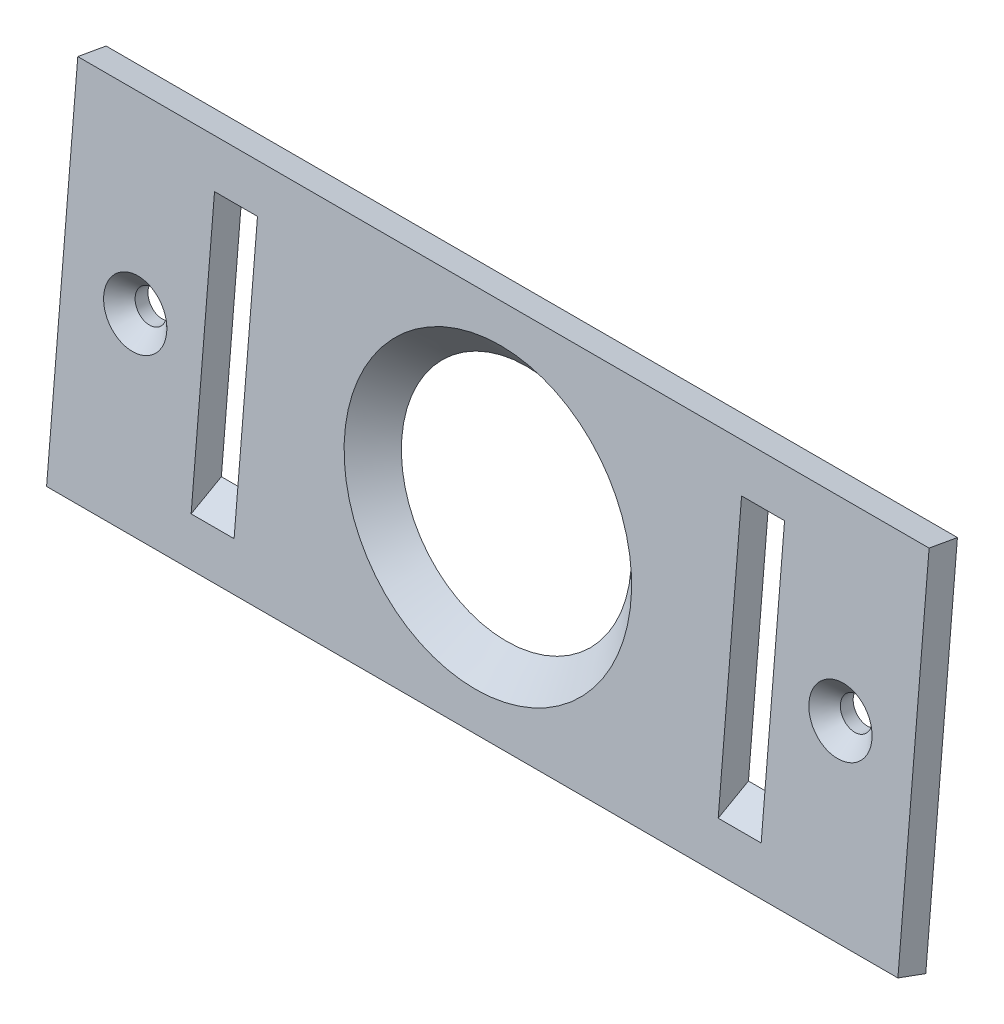
ISO-10303-21;
HEADER;
FILE_DESCRIPTION(('STEP AP214'),'2;1');
FILE_NAME('part.step','',(''),(''),'','','');
FILE_SCHEMA(('AUTOMOTIVE_DESIGN { 1 0 10303 214 1 1 1 1 }'));
ENDSEC;
DATA;
#1=APPLICATION_CONTEXT('core data for automotive mechanical design processes');
#2=APPLICATION_PROTOCOL_DEFINITION('international standard','automotive_design',2000,#1);
#3=PRODUCT_CONTEXT('',#1,'mechanical');
#4=PRODUCT('Part','Part','',(#3));
#5=PRODUCT_RELATED_PRODUCT_CATEGORY('part','',(#4));
#6=PRODUCT_DEFINITION_FORMATION('','',#4);
#7=PRODUCT_DEFINITION_CONTEXT('part definition',#1,'design');
#8=PRODUCT_DEFINITION('design','',#6,#7);
#9=PRODUCT_DEFINITION_SHAPE('','',#8);
#10=(LENGTH_UNIT() NAMED_UNIT(*) SI_UNIT(.MILLI.,.METRE.));
#11=(NAMED_UNIT(*) PLANE_ANGLE_UNIT() SI_UNIT($,.RADIAN.));
#12=(NAMED_UNIT(*) SI_UNIT($,.STERADIAN.) SOLID_ANGLE_UNIT());
#13=UNCERTAINTY_MEASURE_WITH_UNIT(LENGTH_MEASURE(1.E-05),#10,'distance_accuracy_value','');
#14=(GEOMETRIC_REPRESENTATION_CONTEXT(3) GLOBAL_UNCERTAINTY_ASSIGNED_CONTEXT((#13)) GLOBAL_UNIT_ASSIGNED_CONTEXT((#10,
#11,#12)) REPRESENTATION_CONTEXT('',''));
#15=CARTESIAN_POINT('',(0.,0.,0.));
#16=DIRECTION('',(0.,0.,1.));
#17=DIRECTION('',(1.,0.,0.));
#18=AXIS2_PLACEMENT_3D('',#15,#16,#17);
#19=CARTESIAN_POINT('',(-0.0402016209033781,-70.383700116003,12.2294735347792));
#20=DIRECTION('',(0.,-0.939692620785918,0.342020143325643));
#21=DIRECTION('',(0.,-0.342020143325643,-0.939692620785918));
#22=AXIS2_PLACEMENT_3D('',#19,#20,#21);
#23=PLANE('',#22);
#24=DIRECTION('',(1.,0.,0.));
#25=VECTOR('',#24,1.);
#26=CARTESIAN_POINT('',(-1.80258672360719,-70.383700116003,12.2294735347792));
#27=LINE('',#26,#25);
#28=CARTESIAN_POINT('',(-29.72,-70.383700116003,12.2294735347792));
#29=VERTEX_POINT('',#28);
#30=CARTESIAN_POINT('',(29.72,-70.383700116003,12.2294735347792));
#31=VERTEX_POINT('',#30);
#32=EDGE_CURVE('E235',#29,#31,#27,.T.);
#33=ORIENTED_EDGE('',*,*,#32,.T.);
#34=DIRECTION('',(0.,0.342020143325643,0.939692620785918));
#35=VECTOR('',#34,1.);
#36=CARTESIAN_POINT('',(29.72,-66.0808482685836,24.0514618248237));
#37=LINE('',#36,#35);
#38=CARTESIAN_POINT('',(29.72,-69.675529500792,14.1751563091928));
#39=VERTEX_POINT('',#38);
#40=EDGE_CURVE('E231',#31,#39,#37,.T.);
#41=ORIENTED_EDGE('',*,*,#40,.T.);
#42=DIRECTION('',(-1.,0.,0.));
#43=VECTOR('',#42,1.);
#44=CARTESIAN_POINT('',(29.72,-69.675529500792,14.1751563091928));
#45=LINE('',#44,#43);
#46=CARTESIAN_POINT('',(-29.72,-69.675529500792,14.1751563091928));
#47=VERTEX_POINT('',#46);
#48=EDGE_CURVE('E236',#39,#47,#45,.T.);
#49=ORIENTED_EDGE('',*,*,#48,.T.);
#50=DIRECTION('',(0.,0.342020143325643,0.939692620785918));
#51=VECTOR('',#50,1.);
#52=CARTESIAN_POINT('',(-29.72,-66.0808482685836,24.0514618248237));
#53=LINE('',#52,#51);
#54=EDGE_CURVE('E178',#29,#47,#53,.T.);
#55=ORIENTED_EDGE('',*,*,#54,.F.);
#56=EDGE_LOOP('',(#33,#41,#49,#55));
#57=FACE_BOUND('',#56,.T.);
#58=ADVANCED_FACE('F45',(#57),#23,.T.);
#59=CARTESIAN_POINT('',(-0.0402016209033781,-44.7706620484984,11.9962627405015));
#60=DIRECTION('',(0.,0.984807753012095,-0.173648177667572));
#61=DIRECTION('',(0.,0.173648177667572,0.984807753012095));
#62=AXIS2_PLACEMENT_3D('',#59,#60,#61);
#63=PLANE('',#62);
#64=DIRECTION('',(-1.,0.,0.));
#65=VECTOR('',#64,1.);
#66=CARTESIAN_POINT('',(29.72,-44.7706620484984,11.9962627405015));
#67=LINE('',#66,#65);
#68=CARTESIAN_POINT('',(29.72,-44.7706620484984,11.9962627405015));
#69=VERTEX_POINT('',#68);
#70=CARTESIAN_POINT('',(-29.72,-44.7706620484984,11.9962627405015));
#71=VERTEX_POINT('',#70);
#72=EDGE_CURVE('E225',#69,#71,#67,.T.);
#73=ORIENTED_EDGE('',*,*,#72,.F.);
#74=DIRECTION('',(0.,-0.173648177667572,-0.984807753012095));
#75=VECTOR('',#74,1.);
#76=CARTESIAN_POINT('',(29.72,-45.4721431525227,8.01796570845798));
#77=LINE('',#76,#75);
#78=CARTESIAN_POINT('',(29.72,-45.1192850194902,10.0191236232216));
#79=VERTEX_POINT('',#78);
#80=EDGE_CURVE('E232',#69,#79,#77,.T.);
#81=ORIENTED_EDGE('',*,*,#80,.T.);
#82=DIRECTION('',(1.,0.,0.));
#83=VECTOR('',#82,1.);
#84=CARTESIAN_POINT('',(-1.80258672360719,-45.1192850194902,10.0191236232216));
#85=LINE('',#84,#83);
#86=CARTESIAN_POINT('',(-29.72,-45.1192850194902,10.0191236232216));
#87=VERTEX_POINT('',#86);
#88=EDGE_CURVE('E228',#87,#79,#85,.T.);
#89=ORIENTED_EDGE('',*,*,#88,.F.);
#90=DIRECTION('',(0.,-0.173648177667572,-0.984807753012095));
#91=VECTOR('',#90,1.);
#92=CARTESIAN_POINT('',(-29.72,-45.4721431525227,8.01796570845798));
#93=LINE('',#92,#91);
#94=EDGE_CURVE('E179',#71,#87,#93,.T.);
#95=ORIENTED_EDGE('',*,*,#94,.F.);
#96=EDGE_LOOP('',(#73,#81,#89,#95));
#97=FACE_BOUND('',#96,.T.);
#98=ADVANCED_FACE('F282',(#97),#63,.T.);
#99=CARTESIAN_POINT('',(29.72,-44.7706620484984,11.9962627405015));
#100=DIRECTION('',(0.,-0.0871557427476506,-0.996194698091746));
#101=DIRECTION('',(0.,0.996194698091746,-0.0871557427476506));
#102=AXIS2_PLACEMENT_3D('',#99,#100,#101);
#103=PLANE('',#102);
#104=CARTESIAN_POINT('',(0.,-57.2230957746453,13.0857095248472));
#105=DIRECTION('',(0.,-0.0871557427476506,-0.996194698091746));
#106=DIRECTION('',(0.,0.996194698091746,-0.0871557427476506));
#107=AXIS2_PLACEMENT_3D('',#104,#105,#106);
#108=CIRCLE('',#107,10.);
#109=CARTESIAN_POINT('',(0.,-47.2611487937278,12.2141520973707));
#110=VERTEX_POINT('',#109);
#111=EDGE_CURVE('E224',#110,#110,#108,.T.);
#112=ORIENTED_EDGE('',*,*,#111,.T.);
#113=EDGE_LOOP('',(#112));
#114=FACE_BOUND('',#113,.T.);
#115=DIRECTION('',(1.,0.,0.));
#116=VECTOR('',#115,1.);
#117=CARTESIAN_POINT('',(16.9,-66.5582832289655,13.9024325989896));
#118=LINE('',#117,#116);
#119=CARTESIAN_POINT('',(16.9,-66.5582832289655,13.9024325989896));
#120=VERTEX_POINT('',#119);
#121=CARTESIAN_POINT('',(19.9,-66.5582832289655,13.9024325989896));
#122=VERTEX_POINT('',#121);
#123=EDGE_CURVE('E203',#120,#122,#118,.T.);
#124=ORIENTED_EDGE('',*,*,#123,.F.);
#125=DIRECTION('',(0.,-0.996194698091746,0.0871557427476506));
#126=VECTOR('',#125,1.);
#127=CARTESIAN_POINT('',(16.9,-66.5582832289655,13.9024325989896));
#128=LINE('',#127,#126);
#129=CARTESIAN_POINT('',(16.9,-47.8879083203249,12.2689864507048));
#130=VERTEX_POINT('',#129);
#131=EDGE_CURVE('E195',#130,#120,#128,.T.);
#132=ORIENTED_EDGE('',*,*,#131,.F.);
#133=DIRECTION('',(1.,0.,0.));
#134=VECTOR('',#133,1.);
#135=CARTESIAN_POINT('',(16.9,-47.8879083203249,12.2689864507048));
#136=LINE('',#135,#134);
#137=CARTESIAN_POINT('',(19.9,-47.8879083203249,12.2689864507048));
#138=VERTEX_POINT('',#137);
#139=EDGE_CURVE('E208',#130,#138,#136,.T.);
#140=ORIENTED_EDGE('',*,*,#139,.T.);
#141=DIRECTION('',(0.,-0.996194698091746,0.0871557427476506));
#142=VECTOR('',#141,1.);
#143=CARTESIAN_POINT('',(19.9,-66.5582832289655,13.9024325989896));
#144=LINE('',#143,#142);
#145=EDGE_CURVE('E194',#138,#122,#144,.T.);
#146=ORIENTED_EDGE('',*,*,#145,.T.);
#147=EDGE_LOOP('',(#124,#132,#140,#146));
#148=FACE_BOUND('',#147,.T.);
#149=ORIENTED_EDGE('',*,*,#72,.T.);
#150=DIRECTION('',(0.,-0.996194698091746,0.0871557427476506));
#151=VECTOR('',#150,1.);
#152=CARTESIAN_POINT('',(-29.72,-44.7706620484984,11.9962627405015));
#153=LINE('',#152,#151);
#154=EDGE_CURVE('E175',#71,#47,#153,.T.);
#155=ORIENTED_EDGE('',*,*,#154,.T.);
#156=ORIENTED_EDGE('',*,*,#48,.F.);
#157=DIRECTION('',(0.,-0.996194698091746,0.0871557427476506));
#158=VECTOR('',#157,1.);
#159=CARTESIAN_POINT('',(29.72,-44.7706620484984,11.9962627405015));
#160=LINE('',#159,#158);
#161=EDGE_CURVE('E226',#69,#39,#160,.T.);
#162=ORIENTED_EDGE('',*,*,#161,.F.);
#163=EDGE_LOOP('',(#149,#155,#156,#162));
#164=FACE_BOUND('',#163,.T.);
#165=CARTESIAN_POINT('',(24.62,-57.2230957746452,13.0857095248472));
#166=DIRECTION('',(0.,0.0871557427476507,0.996194698091746));
#167=DIRECTION('',(0.,-0.996194698091746,0.0871557427476507));
#168=AXIS2_PLACEMENT_3D('',#165,#166,#167);
#169=CIRCLE('',#168,2.2);
#170=CARTESIAN_POINT('',(24.62,-59.414724110447,13.277452158892));
#171=VERTEX_POINT('',#170);
#172=EDGE_CURVE('E215',#171,#171,#169,.T.);
#173=ORIENTED_EDGE('',*,*,#172,.F.);
#174=EDGE_LOOP('',(#173));
#175=FACE_BOUND('',#174,.T.);
#176=DIRECTION('',(-1.,0.,0.));
#177=VECTOR('',#176,1.);
#178=CARTESIAN_POINT('',(-16.9,-66.5582832289655,13.9024325989896));
#179=LINE('',#178,#177);
#180=CARTESIAN_POINT('',(-16.9,-66.5582832289655,13.9024325989896));
#181=VERTEX_POINT('',#180);
#182=CARTESIAN_POINT('',(-19.9,-66.5582832289655,13.9024325989896));
#183=VERTEX_POINT('',#182);
#184=EDGE_CURVE('E151',#181,#183,#179,.T.);
#185=ORIENTED_EDGE('',*,*,#184,.T.);
#186=DIRECTION('',(0.,-0.996194698091746,0.0871557427476506));
#187=VECTOR('',#186,1.);
#188=CARTESIAN_POINT('',(-19.9,-66.5582832289655,13.9024325989896));
#189=LINE('',#188,#187);
#190=CARTESIAN_POINT('',(-19.9,-47.8879083203249,12.2689864507048));
#191=VERTEX_POINT('',#190);
#192=EDGE_CURVE('E503',#191,#183,#189,.T.);
#193=ORIENTED_EDGE('',*,*,#192,.F.);
#194=DIRECTION('',(-1.,0.,0.));
#195=VECTOR('',#194,1.);
#196=CARTESIAN_POINT('',(-16.9,-47.8879083203249,12.2689864507048));
#197=LINE('',#196,#195);
#198=CARTESIAN_POINT('',(-16.9,-47.8879083203249,12.2689864507048));
#199=VERTEX_POINT('',#198);
#200=EDGE_CURVE('E153',#199,#191,#197,.T.);
#201=ORIENTED_EDGE('',*,*,#200,.F.);
#202=DIRECTION('',(0.,-0.996194698091746,0.0871557427476506));
#203=VECTOR('',#202,1.);
#204=CARTESIAN_POINT('',(-16.9,-66.5582832289655,13.9024325989896));
#205=LINE('',#204,#203);
#206=EDGE_CURVE('E136',#199,#181,#205,.T.);
#207=ORIENTED_EDGE('',*,*,#206,.T.);
#208=EDGE_LOOP('',(#185,#193,#201,#207));
#209=FACE_BOUND('',#208,.T.);
#210=CARTESIAN_POINT('',(-24.62,-57.2230957746452,13.0857095248472));
#211=DIRECTION('',(0.,-0.0871557427476507,-0.996194698091746));
#212=DIRECTION('',(0.,-0.996194698091746,0.0871557427476507));
#213=AXIS2_PLACEMENT_3D('',#210,#211,#212);
#214=CIRCLE('',#213,2.2);
#215=CARTESIAN_POINT('',(-24.62,-59.414724110447,13.277452158892));
#216=VERTEX_POINT('',#215);
#217=EDGE_CURVE('E160',#216,#216,#214,.T.);
#218=ORIENTED_EDGE('',*,*,#217,.T.);
#219=EDGE_LOOP('',(#218));
#220=FACE_BOUND('',#219,.T.);
#221=ADVANCED_FACE('F148',(#114,#148,#164,#175,#209,#220),#103,.F.);
#222=CARTESIAN_POINT('',(29.72,0.,0.));
#223=DIRECTION('',(-1.,0.,0.));
#224=DIRECTION('',(0.,0.,1.));
#225=AXIS2_PLACEMENT_3D('',#222,#223,#224);
#226=PLANE('',#225);
#227=ORIENTED_EDGE('',*,*,#40,.F.);
#228=DIRECTION('',(0.,-0.996194698091747,0.0871557427476391));
#229=VECTOR('',#228,1.);
#230=CARTESIAN_POINT('',(29.72,0.527169618531685,6.02557631224523));
#231=LINE('',#230,#229);
#232=EDGE_CURVE('E222',#79,#31,#231,.T.);
#233=ORIENTED_EDGE('',*,*,#232,.F.);
#234=ORIENTED_EDGE('',*,*,#80,.F.);
#235=ORIENTED_EDGE('',*,*,#161,.T.);
#236=EDGE_LOOP('',(#227,#233,#234,#235));
#237=FACE_BOUND('',#236,.T.);
#238=ADVANCED_FACE('F281',(#237),#226,.F.);
#239=CARTESIAN_POINT('',(-1.80258672360719,-70.383700116003,12.2294735347792));
#240=DIRECTION('',(0.,-0.0871557427476391,-0.996194698091747));
#241=DIRECTION('',(0.,0.996194698091747,-0.0871557427476391));
#242=AXIS2_PLACEMENT_3D('',#239,#240,#241);
#243=PLANE('',#242);
#244=CARTESIAN_POINT('',(0.,-57.3974072601405,11.0933201286645));
#245=DIRECTION('',(0.,0.0871557427476508,0.996194698091746));
#246=DIRECTION('',(0.,-0.996194698091746,0.0871557427476508));
#247=AXIS2_PLACEMENT_3D('',#244,#245,#246);
#248=CIRCLE('',#247,8.);
#249=CARTESIAN_POINT('',(0.,-65.3669648448745,11.7905660706457));
#250=VERTEX_POINT('',#249);
#251=EDGE_CURVE('E211',#250,#250,#248,.T.);
#252=ORIENTED_EDGE('',*,*,#251,.T.);
#253=EDGE_LOOP('',(#252));
#254=FACE_BOUND('',#253,.T.);
#255=DIRECTION('',(0.,0.996194698091747,-0.0871557427476391));
#256=VECTOR('',#255,1.);
#257=CARTESIAN_POINT('',(16.9,-70.383700116003,12.2294735347792));
#258=LINE('',#257,#256);
#259=CARTESIAN_POINT('',(16.9,-65.366964844874,11.7905660706448));
#260=VERTEX_POINT('',#259);
#261=CARTESIAN_POINT('',(16.9,-49.427849675407,10.3960741866827));
#262=VERTEX_POINT('',#261);
#263=EDGE_CURVE('E11',#260,#262,#258,.T.);
#264=ORIENTED_EDGE('',*,*,#263,.F.);
#265=DIRECTION('',(-1.,0.,0.));
#266=VECTOR('',#265,1.);
#267=CARTESIAN_POINT('',(-1.80258672360719,-65.366964844874,11.7905660706448));
#268=LINE('',#267,#266);
#269=CARTESIAN_POINT('',(19.9,-65.366964844874,11.7905660706448));
#270=VERTEX_POINT('',#269);
#271=EDGE_CURVE('E249',#270,#260,#268,.T.);
#272=ORIENTED_EDGE('',*,*,#271,.F.);
#273=DIRECTION('',(0.,0.996194698091747,-0.0871557427476391));
#274=VECTOR('',#273,1.);
#275=CARTESIAN_POINT('',(19.9,-70.383700116003,12.2294735347792));
#276=LINE('',#275,#274);
#277=CARTESIAN_POINT('',(19.9,-49.427849675407,10.3960741866827));
#278=VERTEX_POINT('',#277);
#279=EDGE_CURVE('E246',#270,#278,#276,.T.);
#280=ORIENTED_EDGE('',*,*,#279,.T.);
#281=DIRECTION('',(1.,0.,0.));
#282=VECTOR('',#281,1.);
#283=CARTESIAN_POINT('',(-1.80258672360719,-49.427849675407,10.3960741866827));
#284=LINE('',#283,#282);
#285=EDGE_CURVE('E54',#262,#278,#284,.T.);
#286=ORIENTED_EDGE('',*,*,#285,.F.);
#287=EDGE_LOOP('',(#264,#272,#280,#286));
#288=FACE_BOUND('',#287,.T.);
#289=CARTESIAN_POINT('',(24.62,-57.3974072601405,11.0933201286638));
#290=DIRECTION('',(0.,-0.0871557427476391,-0.996194698091747));
#291=DIRECTION('',(0.,0.996194698091747,-0.0871557427476391));
#292=AXIS2_PLACEMENT_3D('',#289,#290,#291);
#293=CIRCLE('',#292,1.09999999999999);
#294=CARTESIAN_POINT('',(24.62,-56.3015930922396,10.9974488116414));
#295=VERTEX_POINT('',#294);
#296=EDGE_CURVE('E221',#295,#295,#293,.T.);
#297=ORIENTED_EDGE('',*,*,#296,.F.);
#298=EDGE_LOOP('',(#297));
#299=FACE_BOUND('',#298,.T.);
#300=ORIENTED_EDGE('',*,*,#32,.F.);
#301=DIRECTION('',(0.,-0.996194698091747,0.0871557427476391));
#302=VECTOR('',#301,1.);
#303=CARTESIAN_POINT('',(-29.72,0.527169618531685,6.02557631224523));
#304=LINE('',#303,#302);
#305=EDGE_CURVE('E171',#87,#29,#304,.T.);
#306=ORIENTED_EDGE('',*,*,#305,.F.);
#307=ORIENTED_EDGE('',*,*,#88,.T.);
#308=ORIENTED_EDGE('',*,*,#232,.T.);
#309=EDGE_LOOP('',(#300,#306,#307,#308));
#310=FACE_BOUND('',#309,.T.);
#311=DIRECTION('',(0.,0.996194698091747,-0.0871557427476391));
#312=VECTOR('',#311,1.);
#313=CARTESIAN_POINT('',(-16.9,-70.383700116003,12.2294735347792));
#314=LINE('',#313,#312);
#315=CARTESIAN_POINT('',(-16.9,-65.366964844874,11.7905660706448));
#316=VERTEX_POINT('',#315);
#317=CARTESIAN_POINT('',(-16.9,-49.427849675407,10.3960741866827));
#318=VERTEX_POINT('',#317);
#319=EDGE_CURVE('E139',#316,#318,#314,.T.);
#320=ORIENTED_EDGE('',*,*,#319,.T.);
#321=DIRECTION('',(-1.,0.,0.));
#322=VECTOR('',#321,1.);
#323=CARTESIAN_POINT('',(1.80258672360719,-49.427849675407,10.3960741866827));
#324=LINE('',#323,#322);
#325=CARTESIAN_POINT('',(-19.9,-49.427849675407,10.3960741866827));
#326=VERTEX_POINT('',#325);
#327=EDGE_CURVE('E190',#318,#326,#324,.T.);
#328=ORIENTED_EDGE('',*,*,#327,.T.);
#329=DIRECTION('',(0.,0.996194698091747,-0.0871557427476391));
#330=VECTOR('',#329,1.);
#331=CARTESIAN_POINT('',(-19.9,-70.383700116003,12.2294735347792));
#332=LINE('',#331,#330);
#333=CARTESIAN_POINT('',(-19.9,-65.366964844874,11.7905660706448));
#334=VERTEX_POINT('',#333);
#335=EDGE_CURVE('E174',#334,#326,#332,.T.);
#336=ORIENTED_EDGE('',*,*,#335,.F.);
#337=DIRECTION('',(1.,0.,0.));
#338=VECTOR('',#337,1.);
#339=CARTESIAN_POINT('',(1.80258672360719,-65.366964844874,11.7905660706448));
#340=LINE('',#339,#338);
#341=EDGE_CURVE('E188',#334,#316,#340,.T.);
#342=ORIENTED_EDGE('',*,*,#341,.T.);
#343=EDGE_LOOP('',(#320,#328,#336,#342));
#344=FACE_BOUND('',#343,.T.);
#345=CARTESIAN_POINT('',(-24.62,-57.3974072601405,11.0933201286638));
#346=DIRECTION('',(0.,0.0871557427476391,0.996194698091747));
#347=DIRECTION('',(0.,0.996194698091747,-0.0871557427476391));
#348=AXIS2_PLACEMENT_3D('',#345,#346,#347);
#349=CIRCLE('',#348,1.09999999999999);
#350=CARTESIAN_POINT('',(-24.62,-56.3015930922396,10.9974488116414));
#351=VERTEX_POINT('',#350);
#352=EDGE_CURVE('E170',#351,#351,#349,.T.);
#353=ORIENTED_EDGE('',*,*,#352,.T.);
#354=EDGE_LOOP('',(#353));
#355=FACE_BOUND('',#354,.T.);
#356=ADVANCED_FACE('F258',(#254,#288,#299,#310,#344,#355),#243,.T.);
#357=CARTESIAN_POINT('',(24.62,-57.2230957746452,13.0857095248472));
#358=DIRECTION('',(0.,0.0871557427476507,0.996194698091746));
#359=DIRECTION('',(0.,-0.996194698091746,0.0871557427476507));
#360=AXIS2_PLACEMENT_3D('',#357,#358,#359);
#361=CYLINDRICAL_SURFACE('',#360,1.09999999999999);
#362=ORIENTED_EDGE('',*,*,#296,.T.);
#363=EDGE_LOOP('',(#362));
#364=FACE_BOUND('',#363,.T.);
#365=CARTESIAN_POINT('',(24.62,-57.3189670916676,11.9898953569463));
#366=DIRECTION('',(0.,0.0871557427476507,0.996194698091746));
#367=DIRECTION('',(0.,-0.996194698091746,0.0871557427476507));
#368=AXIS2_PLACEMENT_3D('',#365,#366,#367);
#369=CIRCLE('',#368,1.09999999999999);
#370=CARTESIAN_POINT('',(24.62,-58.4147812595685,12.0857666739687));
#371=VERTEX_POINT('',#370);
#372=EDGE_CURVE('E218',#371,#371,#369,.T.);
#373=ORIENTED_EDGE('',*,*,#372,.T.);
#374=EDGE_LOOP('',(#373));
#375=FACE_BOUND('',#374,.T.);
#376=ADVANCED_FACE('F294',(#364,#375),#361,.F.);
#377=CARTESIAN_POINT('',(24.62,-57.2230957746452,13.0857095248472));
#378=DIRECTION('',(0.,0.0871557427476507,0.996194698091746));
#379=DIRECTION('',(0.,-0.996194698091746,0.0871557427476507));
#380=AXIS2_PLACEMENT_3D('',#377,#378,#379);
#381=CONICAL_SURFACE('',#380,2.2,0.785398163397457);
#382=ORIENTED_EDGE('',*,*,#372,.F.);
#383=EDGE_LOOP('',(#382));
#384=FACE_BOUND('',#383,.T.);
#385=ORIENTED_EDGE('',*,*,#172,.T.);
#386=EDGE_LOOP('',(#385));
#387=FACE_BOUND('',#386,.T.);
#388=ADVANCED_FACE('F310',(#384,#387),#381,.F.);
#389=CARTESIAN_POINT('',(0.,-57.3974072601406,11.0933201286637));
#390=DIRECTION('',(0.,0.0871557427476497,0.996194698091746));
#391=DIRECTION('',(0.,-0.996194698091746,0.0871557427476497));
#392=AXIS2_PLACEMENT_3D('',#389,#390,#391);
#393=CONICAL_SURFACE('',#392,8.,0.785398163397452);
#394=ORIENTED_EDGE('',*,*,#111,.F.);
#395=EDGE_LOOP('',(#394));
#396=FACE_BOUND('',#395,.T.);
#397=ORIENTED_EDGE('',*,*,#251,.F.);
#398=EDGE_LOOP('',(#397));
#399=FACE_BOUND('',#398,.T.);
#400=ADVANCED_FACE('F48',(#396,#399),#393,.F.);
#401=CARTESIAN_POINT('',(16.9,-47.8879083203249,12.2689864507048));
#402=DIRECTION('',(0.,0.772427251987571,-0.63510325175276));
#403=DIRECTION('',(0.,0.63510325175276,0.772427251987571));
#404=AXIS2_PLACEMENT_3D('',#401,#402,#403);
#405=PLANE('',#404);
#406=ORIENTED_EDGE('',*,*,#285,.T.);
#407=DIRECTION('',(0.,0.63510325175276,0.772427251987571));
#408=VECTOR('',#407,1.);
#409=CARTESIAN_POINT('',(19.9,-47.8879083203249,12.2689864507048));
#410=LINE('',#409,#408);
#411=EDGE_CURVE('E66',#278,#138,#410,.T.);
#412=ORIENTED_EDGE('',*,*,#411,.T.);
#413=ORIENTED_EDGE('',*,*,#139,.F.);
#414=DIRECTION('',(0.,0.63510325175276,0.772427251987571));
#415=VECTOR('',#414,1.);
#416=CARTESIAN_POINT('',(16.9,-47.8879083203249,12.2689864507048));
#417=LINE('',#416,#415);
#418=EDGE_CURVE('E201',#262,#130,#417,.T.);
#419=ORIENTED_EDGE('',*,*,#418,.F.);
#420=EDGE_LOOP('',(#406,#412,#413,#419));
#421=FACE_BOUND('',#420,.T.);
#422=ADVANCED_FACE('F253',(#421),#405,.F.);
#423=CARTESIAN_POINT('',(16.9,-60.6726344272831,3.46886180225977));
#424=DIRECTION('',(0.,-0.870976868692479,-0.491324021601473));
#425=DIRECTION('',(0.,0.491324021601473,-0.870976868692479));
#426=AXIS2_PLACEMENT_3D('',#423,#424,#425);
#427=PLANE('',#426);
#428=ORIENTED_EDGE('',*,*,#271,.T.);
#429=DIRECTION('',(0.,0.491324021601473,-0.870976868692478));
#430=VECTOR('',#429,1.);
#431=CARTESIAN_POINT('',(16.9,-60.6726344272831,3.46886180225977));
#432=LINE('',#431,#430);
#433=EDGE_CURVE('E198',#120,#260,#432,.T.);
#434=ORIENTED_EDGE('',*,*,#433,.F.);
#435=ORIENTED_EDGE('',*,*,#123,.T.);
#436=DIRECTION('',(0.,0.491324021601473,-0.870976868692478));
#437=VECTOR('',#436,1.);
#438=CARTESIAN_POINT('',(19.9,-60.6726344272831,3.46886180225977));
#439=LINE('',#438,#437);
#440=EDGE_CURVE('E61',#122,#270,#439,.T.);
#441=ORIENTED_EDGE('',*,*,#440,.T.);
#442=EDGE_LOOP('',(#428,#434,#435,#441));
#443=FACE_BOUND('',#442,.T.);
#444=ADVANCED_FACE('F262',(#443),#427,.F.);
#445=CARTESIAN_POINT('',(16.9,-57.9290572909012,5.01653247030481));
#446=DIRECTION('',(-1.,0.,0.));
#447=DIRECTION('',(0.,0.,1.));
#448=AXIS2_PLACEMENT_3D('',#445,#446,#447);
#449=PLANE('',#448);
#450=ORIENTED_EDGE('',*,*,#263,.T.);
#451=ORIENTED_EDGE('',*,*,#418,.T.);
#452=ORIENTED_EDGE('',*,*,#131,.T.);
#453=ORIENTED_EDGE('',*,*,#433,.T.);
#454=EDGE_LOOP('',(#450,#451,#452,#453));
#455=FACE_BOUND('',#454,.T.);
#456=ADVANCED_FACE('F268',(#455),#449,.F.);
#457=CARTESIAN_POINT('',(19.9,-57.9290572909012,5.01653247030481));
#458=DIRECTION('',(-1.,0.,0.));
#459=DIRECTION('',(0.,0.,1.));
#460=AXIS2_PLACEMENT_3D('',#457,#458,#459);
#461=PLANE('',#460);
#462=ORIENTED_EDGE('',*,*,#440,.F.);
#463=ORIENTED_EDGE('',*,*,#145,.F.);
#464=ORIENTED_EDGE('',*,*,#411,.F.);
#465=ORIENTED_EDGE('',*,*,#279,.F.);
#466=EDGE_LOOP('',(#462,#463,#464,#465));
#467=FACE_BOUND('',#466,.T.);
#468=ADVANCED_FACE('F260',(#467),#461,.T.);
#469=CARTESIAN_POINT('',(-29.72,0.,0.));
#470=DIRECTION('',(1.,0.,0.));
#471=DIRECTION('',(0.,0.,1.));
#472=AXIS2_PLACEMENT_3D('',#469,#470,#471);
#473=PLANE('',#472);
#474=ORIENTED_EDGE('',*,*,#54,.T.);
#475=ORIENTED_EDGE('',*,*,#154,.F.);
#476=ORIENTED_EDGE('',*,*,#94,.T.);
#477=ORIENTED_EDGE('',*,*,#305,.T.);
#478=EDGE_LOOP('',(#474,#475,#476,#477));
#479=FACE_BOUND('',#478,.T.);
#480=ADVANCED_FACE('F276',(#479),#473,.F.);
#481=CARTESIAN_POINT('',(-24.62,-57.2230957746452,13.0857095248472));
#482=DIRECTION('',(0.,0.0871557427476507,0.996194698091746));
#483=DIRECTION('',(0.,-0.996194698091746,0.0871557427476507));
#484=AXIS2_PLACEMENT_3D('',#481,#482,#483);
#485=CYLINDRICAL_SURFACE('',#484,1.09999999999999);
#486=ORIENTED_EDGE('',*,*,#352,.F.);
#487=EDGE_LOOP('',(#486));
#488=FACE_BOUND('',#487,.T.);
#489=CARTESIAN_POINT('',(-24.62,-57.3189670916676,11.9898953569463));
#490=DIRECTION('',(0.,-0.0871557427476507,-0.996194698091746));
#491=DIRECTION('',(0.,-0.996194698091746,0.0871557427476507));
#492=AXIS2_PLACEMENT_3D('',#489,#490,#491);
#493=CIRCLE('',#492,1.09999999999999);
#494=CARTESIAN_POINT('',(-24.62,-58.4147812595685,12.0857666739687));
#495=VERTEX_POINT('',#494);
#496=EDGE_CURVE('E167',#495,#495,#493,.T.);
#497=ORIENTED_EDGE('',*,*,#496,.F.);
#498=EDGE_LOOP('',(#497));
#499=FACE_BOUND('',#498,.T.);
#500=ADVANCED_FACE('F364',(#488,#499),#485,.F.);
#501=CARTESIAN_POINT('',(-24.62,-57.2230957746452,13.0857095248472));
#502=DIRECTION('',(0.,0.0871557427476507,0.996194698091746));
#503=DIRECTION('',(0.,-0.996194698091746,0.0871557427476507));
#504=AXIS2_PLACEMENT_3D('',#501,#502,#503);
#505=CONICAL_SURFACE('',#504,2.2,0.785398163397457);
#506=ORIENTED_EDGE('',*,*,#496,.T.);
#507=EDGE_LOOP('',(#506));
#508=FACE_BOUND('',#507,.T.);
#509=ORIENTED_EDGE('',*,*,#217,.F.);
#510=EDGE_LOOP('',(#509));
#511=FACE_BOUND('',#510,.T.);
#512=ADVANCED_FACE('F358',(#508,#511),#505,.F.);
#513=CARTESIAN_POINT('',(-16.9,-47.8879083203249,12.2689864507048));
#514=DIRECTION('',(0.,0.772427251987571,-0.63510325175276));
#515=DIRECTION('',(0.,0.63510325175276,0.772427251987571));
#516=AXIS2_PLACEMENT_3D('',#513,#514,#515);
#517=PLANE('',#516);
#518=ORIENTED_EDGE('',*,*,#327,.F.);
#519=DIRECTION('',(0.,0.63510325175276,0.772427251987571));
#520=VECTOR('',#519,1.);
#521=CARTESIAN_POINT('',(-16.9,-47.8879083203249,12.2689864507048));
#522=LINE('',#521,#520);
#523=EDGE_CURVE('E144',#318,#199,#522,.T.);
#524=ORIENTED_EDGE('',*,*,#523,.T.);
#525=ORIENTED_EDGE('',*,*,#200,.T.);
#526=DIRECTION('',(0.,0.63510325175276,0.772427251987571));
#527=VECTOR('',#526,1.);
#528=CARTESIAN_POINT('',(-19.9,-47.8879083203249,12.2689864507048));
#529=LINE('',#528,#527);
#530=EDGE_CURVE('E154',#326,#191,#529,.T.);
#531=ORIENTED_EDGE('',*,*,#530,.F.);
#532=EDGE_LOOP('',(#518,#524,#525,#531));
#533=FACE_BOUND('',#532,.T.);
#534=ADVANCED_FACE('F363',(#533),#517,.F.);
#535=CARTESIAN_POINT('',(-16.9,-60.6726344272831,3.46886180225977));
#536=DIRECTION('',(0.,-0.870976868692479,-0.491324021601473));
#537=DIRECTION('',(0.,0.491324021601473,-0.870976868692479));
#538=AXIS2_PLACEMENT_3D('',#535,#536,#537);
#539=PLANE('',#538);
#540=ORIENTED_EDGE('',*,*,#341,.F.);
#541=DIRECTION('',(0.,0.491324021601473,-0.870976868692478));
#542=VECTOR('',#541,1.);
#543=CARTESIAN_POINT('',(-19.9,-60.6726344272831,3.46886180225977));
#544=LINE('',#543,#542);
#545=EDGE_CURVE('E157',#183,#334,#544,.T.);
#546=ORIENTED_EDGE('',*,*,#545,.F.);
#547=ORIENTED_EDGE('',*,*,#184,.F.);
#548=DIRECTION('',(0.,0.491324021601473,-0.870976868692478));
#549=VECTOR('',#548,1.);
#550=CARTESIAN_POINT('',(-16.9,-60.6726344272831,3.46886180225977));
#551=LINE('',#550,#549);
#552=EDGE_CURVE('E133',#181,#316,#551,.T.);
#553=ORIENTED_EDGE('',*,*,#552,.T.);
#554=EDGE_LOOP('',(#540,#546,#547,#553));
#555=FACE_BOUND('',#554,.T.);
#556=ADVANCED_FACE('F156',(#555),#539,.F.);
#557=CARTESIAN_POINT('',(-16.9,-57.9290572909012,5.01653247030481));
#558=DIRECTION('',(1.,0.,0.));
#559=DIRECTION('',(0.,0.,1.));
#560=AXIS2_PLACEMENT_3D('',#557,#558,#559);
#561=PLANE('',#560);
#562=ORIENTED_EDGE('',*,*,#319,.F.);
#563=ORIENTED_EDGE('',*,*,#552,.F.);
#564=ORIENTED_EDGE('',*,*,#206,.F.);
#565=ORIENTED_EDGE('',*,*,#523,.F.);
#566=EDGE_LOOP('',(#562,#563,#564,#565));
#567=FACE_BOUND('',#566,.T.);
#568=ADVANCED_FACE('F135',(#567),#561,.F.);
#569=CARTESIAN_POINT('',(-19.9,-57.9290572909012,5.01653247030481));
#570=DIRECTION('',(1.,0.,0.));
#571=DIRECTION('',(0.,0.,1.));
#572=AXIS2_PLACEMENT_3D('',#569,#570,#571);
#573=PLANE('',#572);
#574=ORIENTED_EDGE('',*,*,#545,.T.);
#575=ORIENTED_EDGE('',*,*,#335,.T.);
#576=ORIENTED_EDGE('',*,*,#530,.T.);
#577=ORIENTED_EDGE('',*,*,#192,.T.);
#578=EDGE_LOOP('',(#574,#575,#576,#577));
#579=FACE_BOUND('',#578,.T.);
#580=ADVANCED_FACE('F398',(#579),#573,.T.);
#581=CLOSED_SHELL('',(#58,#98,#221,#238,#356,#376,#388,#400,#422,#444,#456,#468,#480,#500,#512,
#534,#556,#568,#580));
#582=MANIFOLD_SOLID_BREP('B2',#581);
#583=ADVANCED_BREP_SHAPE_REPRESENTATION('',(#18,#582),#14);
#584=SHAPE_DEFINITION_REPRESENTATION(#9,#583);
ENDSEC;
END-ISO-10303-21;
